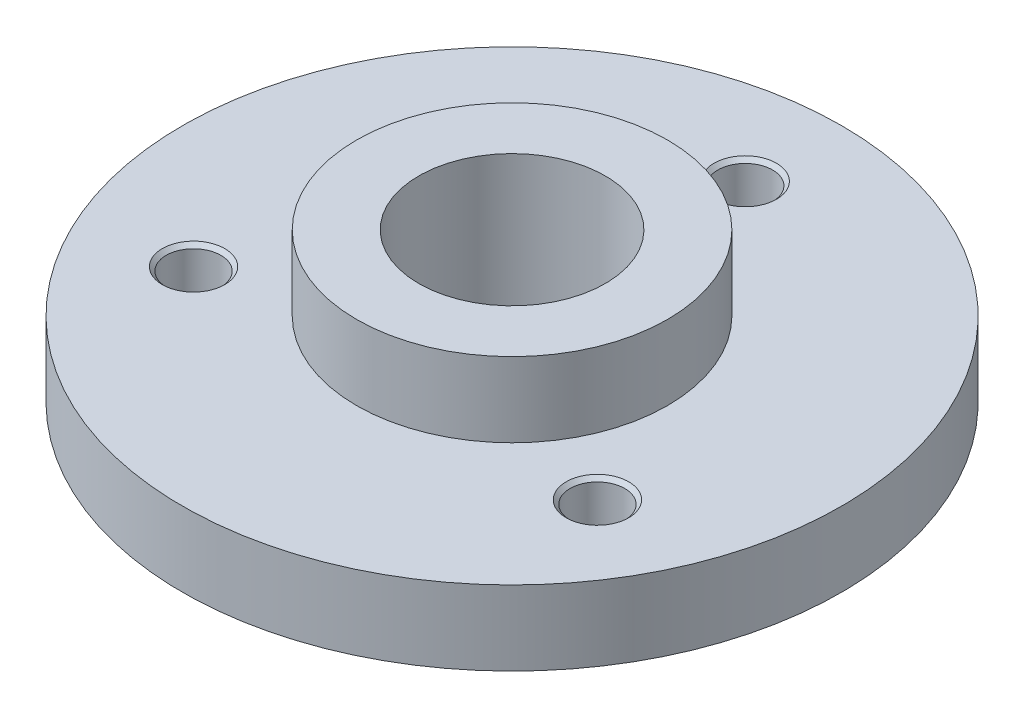
ISO-10303-21;
HEADER;
FILE_DESCRIPTION(('STEP AP214'),'2;1');
FILE_NAME('part.step','',(''),(''),'','','');
FILE_SCHEMA(('AUTOMOTIVE_DESIGN { 1 0 10303 214 1 1 1 1 }'));
ENDSEC;
DATA;
#1=APPLICATION_CONTEXT('core data for automotive mechanical design processes');
#2=APPLICATION_PROTOCOL_DEFINITION('international standard','automotive_design',2000,#1);
#3=PRODUCT_CONTEXT('',#1,'mechanical');
#4=PRODUCT('Part','Part','',(#3));
#5=PRODUCT_RELATED_PRODUCT_CATEGORY('part','',(#4));
#6=PRODUCT_DEFINITION_FORMATION('','',#4);
#7=PRODUCT_DEFINITION_CONTEXT('part definition',#1,'design');
#8=PRODUCT_DEFINITION('design','',#6,#7);
#9=PRODUCT_DEFINITION_SHAPE('','',#8);
#10=(LENGTH_UNIT() NAMED_UNIT(*) SI_UNIT(.MILLI.,.METRE.));
#11=(NAMED_UNIT(*) PLANE_ANGLE_UNIT() SI_UNIT($,.RADIAN.));
#12=(NAMED_UNIT(*) SI_UNIT($,.STERADIAN.) SOLID_ANGLE_UNIT());
#13=UNCERTAINTY_MEASURE_WITH_UNIT(LENGTH_MEASURE(1.E-05),#10,'distance_accuracy_value','');
#14=(GEOMETRIC_REPRESENTATION_CONTEXT(3) GLOBAL_UNCERTAINTY_ASSIGNED_CONTEXT((#13)) GLOBAL_UNIT_ASSIGNED_CONTEXT((#10,
#11,#12)) REPRESENTATION_CONTEXT('',''));
#15=CARTESIAN_POINT('',(0.,0.,0.));
#16=DIRECTION('',(0.,0.,1.));
#17=DIRECTION('',(1.,0.,0.));
#18=AXIS2_PLACEMENT_3D('',#15,#16,#17);
#19=CARTESIAN_POINT('',(0.,0.,-53.));
#20=DIRECTION('',(0.,-1.,0.));
#21=DIRECTION('',(0.,0.,-1.));
#22=AXIS2_PLACEMENT_3D('',#19,#20,#21);
#23=PLANE('',#22);
#24=CARTESIAN_POINT('',(-32.4759526419166,0.,18.7499999999997));
#25=DIRECTION('',(0.,1.,0.));
#26=DIRECTION('',(0.,0.,1.));
#27=AXIS2_PLACEMENT_3D('',#24,#25,#26);
#28=CIRCLE('',#27,4.4);
#29=CARTESIAN_POINT('',(-32.4759526419166,0.,23.1499999999997));
#30=VERTEX_POINT('',#29);
#31=EDGE_CURVE('E102',#30,#30,#28,.T.);
#32=ORIENTED_EDGE('',*,*,#31,.T.);
#33=EDGE_LOOP('',(#32));
#34=FACE_BOUND('',#33,.T.);
#35=CARTESIAN_POINT('',(32.4759526419164,0.,18.7500000000002));
#36=DIRECTION('',(0.,1.,0.));
#37=DIRECTION('',(0.,0.,1.));
#38=AXIS2_PLACEMENT_3D('',#35,#36,#37);
#39=CIRCLE('',#38,4.39999999999999);
#40=CARTESIAN_POINT('',(32.4759526419164,0.,23.1500000000001));
#41=VERTEX_POINT('',#40);
#42=EDGE_CURVE('E90',#41,#41,#39,.T.);
#43=ORIENTED_EDGE('',*,*,#42,.T.);
#44=EDGE_LOOP('',(#43));
#45=FACE_BOUND('',#44,.T.);
#46=CARTESIAN_POINT('',(0.,0.,-37.5));
#47=DIRECTION('',(0.,1.,0.));
#48=DIRECTION('',(0.,0.,1.));
#49=AXIS2_PLACEMENT_3D('',#46,#47,#48);
#50=CIRCLE('',#49,4.4);
#51=CARTESIAN_POINT('',(0.,0.,-33.1));
#52=VERTEX_POINT('',#51);
#53=EDGE_CURVE('E78',#52,#52,#50,.T.);
#54=ORIENTED_EDGE('',*,*,#53,.T.);
#55=EDGE_LOOP('',(#54));
#56=FACE_BOUND('',#55,.T.);
#57=CARTESIAN_POINT('',(0.,0.,0.));
#58=DIRECTION('',(0.,1.,0.));
#59=DIRECTION('',(0.,0.,1.));
#60=AXIS2_PLACEMENT_3D('',#57,#58,#59);
#61=CIRCLE('',#60,15.);
#62=CARTESIAN_POINT('',(0.,0.,15.));
#63=VERTEX_POINT('',#62);
#64=EDGE_CURVE('E70',#63,#63,#61,.T.);
#65=ORIENTED_EDGE('',*,*,#64,.T.);
#66=EDGE_LOOP('',(#65));
#67=FACE_BOUND('',#66,.T.);
#68=CARTESIAN_POINT('',(0.,0.,0.));
#69=DIRECTION('',(0.,-1.,0.));
#70=DIRECTION('',(0.,0.,-1.));
#71=AXIS2_PLACEMENT_3D('',#68,#69,#70);
#72=CIRCLE('',#71,53.);
#73=CARTESIAN_POINT('',(0.,0.,-53.));
#74=VERTEX_POINT('',#73);
#75=EDGE_CURVE('E64',#74,#74,#72,.T.);
#76=ORIENTED_EDGE('',*,*,#75,.T.);
#77=EDGE_LOOP('',(#76));
#78=FACE_BOUND('',#77,.T.);
#79=ADVANCED_FACE('F47',(#34,#45,#56,#67,#78),#23,.T.);
#80=CARTESIAN_POINT('',(0.,24.,0.));
#81=DIRECTION('',(0.,1.,0.));
#82=DIRECTION('',(0.,0.,1.));
#83=AXIS2_PLACEMENT_3D('',#80,#81,#82);
#84=PLANE('',#83);
#85=CARTESIAN_POINT('',(0.,24.,0.));
#86=DIRECTION('',(0.,1.,0.));
#87=DIRECTION('',(0.,0.,1.));
#88=AXIS2_PLACEMENT_3D('',#85,#86,#87);
#89=CIRCLE('',#88,15.);
#90=CARTESIAN_POINT('',(0.,24.,15.));
#91=VERTEX_POINT('',#90);
#92=EDGE_CURVE('E74',#91,#91,#89,.T.);
#93=ORIENTED_EDGE('',*,*,#92,.F.);
#94=EDGE_LOOP('',(#93));
#95=FACE_BOUND('',#94,.T.);
#96=CARTESIAN_POINT('',(0.,24.,0.));
#97=DIRECTION('',(0.,-1.,0.));
#98=DIRECTION('',(0.,0.,-1.));
#99=AXIS2_PLACEMENT_3D('',#96,#97,#98);
#100=CIRCLE('',#99,25.);
#101=CARTESIAN_POINT('',(0.,24.,-25.));
#102=VERTEX_POINT('',#101);
#103=EDGE_CURVE('E10',#102,#102,#100,.T.);
#104=ORIENTED_EDGE('',*,*,#103,.F.);
#105=EDGE_LOOP('',(#104));
#106=FACE_BOUND('',#105,.T.);
#107=ADVANCED_FACE('F136',(#95,#106),#84,.T.);
#108=CARTESIAN_POINT('',(0.,0.,0.));
#109=DIRECTION('',(0.,-1.,0.));
#110=DIRECTION('',(0.,0.,-1.));
#111=AXIS2_PLACEMENT_3D('',#108,#109,#110);
#112=CYLINDRICAL_SURFACE('',#111,25.);
#113=ORIENTED_EDGE('',*,*,#103,.T.);
#114=EDGE_LOOP('',(#113));
#115=FACE_BOUND('',#114,.T.);
#116=CARTESIAN_POINT('',(0.,12.,0.));
#117=DIRECTION('',(0.,-1.,0.));
#118=DIRECTION('',(0.,0.,-1.));
#119=AXIS2_PLACEMENT_3D('',#116,#117,#118);
#120=CIRCLE('',#119,25.);
#121=CARTESIAN_POINT('',(0.,12.,-25.));
#122=VERTEX_POINT('',#121);
#123=EDGE_CURVE('E54',#122,#122,#120,.T.);
#124=ORIENTED_EDGE('',*,*,#123,.F.);
#125=EDGE_LOOP('',(#124));
#126=FACE_BOUND('',#125,.T.);
#127=ADVANCED_FACE('F121',(#115,#126),#112,.T.);
#128=CARTESIAN_POINT('',(0.,12.,-25.));
#129=DIRECTION('',(0.,1.,0.));
#130=DIRECTION('',(0.,0.,1.));
#131=AXIS2_PLACEMENT_3D('',#128,#129,#130);
#132=PLANE('',#131);
#133=CARTESIAN_POINT('',(-32.4759526419166,12.,18.7499999999997));
#134=DIRECTION('',(0.,1.,0.));
#135=DIRECTION('',(0.,0.,1.));
#136=AXIS2_PLACEMENT_3D('',#133,#134,#135);
#137=CIRCLE('',#136,5.025);
#138=CARTESIAN_POINT('',(-32.4759526419166,12.,23.7749999999997));
#139=VERTEX_POINT('',#138);
#140=EDGE_CURVE('E110',#139,#139,#137,.T.);
#141=ORIENTED_EDGE('',*,*,#140,.F.);
#142=EDGE_LOOP('',(#141));
#143=FACE_BOUND('',#142,.T.);
#144=CARTESIAN_POINT('',(32.4759526419164,12.,18.7500000000002));
#145=DIRECTION('',(0.,1.,0.));
#146=DIRECTION('',(0.,0.,1.));
#147=AXIS2_PLACEMENT_3D('',#144,#145,#146);
#148=CIRCLE('',#147,5.025);
#149=CARTESIAN_POINT('',(32.4759526419164,12.,23.7750000000002));
#150=VERTEX_POINT('',#149);
#151=EDGE_CURVE('E98',#150,#150,#148,.T.);
#152=ORIENTED_EDGE('',*,*,#151,.F.);
#153=EDGE_LOOP('',(#152));
#154=FACE_BOUND('',#153,.T.);
#155=CARTESIAN_POINT('',(0.,12.,-37.5));
#156=DIRECTION('',(0.,1.,0.));
#157=DIRECTION('',(0.,0.,1.));
#158=AXIS2_PLACEMENT_3D('',#155,#156,#157);
#159=CIRCLE('',#158,5.025);
#160=CARTESIAN_POINT('',(0.,12.,-32.475));
#161=VERTEX_POINT('',#160);
#162=EDGE_CURVE('E86',#161,#161,#159,.T.);
#163=ORIENTED_EDGE('',*,*,#162,.F.);
#164=EDGE_LOOP('',(#163));
#165=FACE_BOUND('',#164,.T.);
#166=ORIENTED_EDGE('',*,*,#123,.T.);
#167=EDGE_LOOP('',(#166));
#168=FACE_BOUND('',#167,.T.);
#169=CARTESIAN_POINT('',(0.,12.,0.));
#170=DIRECTION('',(0.,-1.,0.));
#171=DIRECTION('',(0.,0.,-1.));
#172=AXIS2_PLACEMENT_3D('',#169,#170,#171);
#173=CIRCLE('',#172,53.);
#174=CARTESIAN_POINT('',(0.,12.,-53.));
#175=VERTEX_POINT('',#174);
#176=EDGE_CURVE('E59',#175,#175,#173,.T.);
#177=ORIENTED_EDGE('',*,*,#176,.F.);
#178=EDGE_LOOP('',(#177));
#179=FACE_BOUND('',#178,.T.);
#180=ADVANCED_FACE('F117',(#143,#154,#165,#168,#179),#132,.T.);
#181=CARTESIAN_POINT('',(0.,0.,0.));
#182=DIRECTION('',(0.,-1.,0.));
#183=DIRECTION('',(0.,0.,-1.));
#184=AXIS2_PLACEMENT_3D('',#181,#182,#183);
#185=CYLINDRICAL_SURFACE('',#184,53.);
#186=ORIENTED_EDGE('',*,*,#176,.T.);
#187=EDGE_LOOP('',(#186));
#188=FACE_BOUND('',#187,.T.);
#189=ORIENTED_EDGE('',*,*,#75,.F.);
#190=EDGE_LOOP('',(#189));
#191=FACE_BOUND('',#190,.T.);
#192=ADVANCED_FACE('F120',(#188,#191),#185,.T.);
#193=CARTESIAN_POINT('',(0.,24.,0.));
#194=DIRECTION('',(0.,1.,0.));
#195=DIRECTION('',(0.,0.,1.));
#196=AXIS2_PLACEMENT_3D('',#193,#194,#195);
#197=CYLINDRICAL_SURFACE('',#196,15.);
#198=ORIENTED_EDGE('',*,*,#64,.F.);
#199=EDGE_LOOP('',(#198));
#200=FACE_BOUND('',#199,.T.);
#201=ORIENTED_EDGE('',*,*,#92,.T.);
#202=EDGE_LOOP('',(#201));
#203=FACE_BOUND('',#202,.T.);
#204=ADVANCED_FACE('F131',(#200,#203),#197,.F.);
#205=CARTESIAN_POINT('',(0.,12.,-37.5));
#206=DIRECTION('',(0.,1.,0.));
#207=DIRECTION('',(0.,0.,1.));
#208=AXIS2_PLACEMENT_3D('',#205,#206,#207);
#209=CYLINDRICAL_SURFACE('',#208,4.4);
#210=ORIENTED_EDGE('',*,*,#53,.F.);
#211=EDGE_LOOP('',(#210));
#212=FACE_BOUND('',#211,.T.);
#213=CARTESIAN_POINT('',(0.,11.375,-37.5));
#214=DIRECTION('',(0.,1.,0.));
#215=DIRECTION('',(0.,0.,1.));
#216=AXIS2_PLACEMENT_3D('',#213,#214,#215);
#217=CIRCLE('',#216,4.4);
#218=CARTESIAN_POINT('',(0.,11.375,-33.1));
#219=VERTEX_POINT('',#218);
#220=EDGE_CURVE('E82',#219,#219,#217,.T.);
#221=ORIENTED_EDGE('',*,*,#220,.T.);
#222=EDGE_LOOP('',(#221));
#223=FACE_BOUND('',#222,.T.);
#224=ADVANCED_FACE('F153',(#212,#223),#209,.F.);
#225=CARTESIAN_POINT('',(0.,12.,-37.5));
#226=DIRECTION('',(0.,1.,0.));
#227=DIRECTION('',(0.,0.,1.));
#228=AXIS2_PLACEMENT_3D('',#225,#226,#227);
#229=CONICAL_SURFACE('',#228,5.025,0.785398163397447);
#230=ORIENTED_EDGE('',*,*,#220,.F.);
#231=EDGE_LOOP('',(#230));
#232=FACE_BOUND('',#231,.T.);
#233=ORIENTED_EDGE('',*,*,#162,.T.);
#234=EDGE_LOOP('',(#233));
#235=FACE_BOUND('',#234,.T.);
#236=ADVANCED_FACE('F161',(#232,#235),#229,.F.);
#237=CARTESIAN_POINT('',(32.4759526419164,12.,18.7500000000002));
#238=DIRECTION('',(0.,1.,0.));
#239=DIRECTION('',(0.,0.,1.));
#240=AXIS2_PLACEMENT_3D('',#237,#238,#239);
#241=CYLINDRICAL_SURFACE('',#240,4.4);
#242=ORIENTED_EDGE('',*,*,#42,.F.);
#243=EDGE_LOOP('',(#242));
#244=FACE_BOUND('',#243,.T.);
#245=CARTESIAN_POINT('',(32.4759526419164,11.375,18.7500000000002));
#246=DIRECTION('',(0.,1.,0.));
#247=DIRECTION('',(0.,0.,1.));
#248=AXIS2_PLACEMENT_3D('',#245,#246,#247);
#249=CIRCLE('',#248,4.4);
#250=CARTESIAN_POINT('',(32.4759526419164,11.375,23.1500000000002));
#251=VERTEX_POINT('',#250);
#252=EDGE_CURVE('E94',#251,#251,#249,.T.);
#253=ORIENTED_EDGE('',*,*,#252,.T.);
#254=EDGE_LOOP('',(#253));
#255=FACE_BOUND('',#254,.T.);
#256=ADVANCED_FACE('F209',(#244,#255),#241,.F.);
#257=CARTESIAN_POINT('',(32.4759526419164,12.,18.7500000000002));
#258=DIRECTION('',(0.,1.,0.));
#259=DIRECTION('',(0.,0.,1.));
#260=AXIS2_PLACEMENT_3D('',#257,#258,#259);
#261=CONICAL_SURFACE('',#260,5.025,0.785398163397444);
#262=ORIENTED_EDGE('',*,*,#252,.F.);
#263=EDGE_LOOP('',(#262));
#264=FACE_BOUND('',#263,.T.);
#265=ORIENTED_EDGE('',*,*,#151,.T.);
#266=EDGE_LOOP('',(#265));
#267=FACE_BOUND('',#266,.T.);
#268=ADVANCED_FACE('F217',(#264,#267),#261,.F.);
#269=CARTESIAN_POINT('',(-32.4759526419166,12.,18.7499999999997));
#270=DIRECTION('',(0.,1.,0.));
#271=DIRECTION('',(0.,0.,1.));
#272=AXIS2_PLACEMENT_3D('',#269,#270,#271);
#273=CYLINDRICAL_SURFACE('',#272,4.4);
#274=ORIENTED_EDGE('',*,*,#31,.F.);
#275=EDGE_LOOP('',(#274));
#276=FACE_BOUND('',#275,.T.);
#277=CARTESIAN_POINT('',(-32.4759526419166,11.375,18.7499999999997));
#278=DIRECTION('',(0.,1.,0.));
#279=DIRECTION('',(0.,0.,1.));
#280=AXIS2_PLACEMENT_3D('',#277,#278,#279);
#281=CIRCLE('',#280,4.4);
#282=CARTESIAN_POINT('',(-32.4759526419166,11.375,23.1499999999997));
#283=VERTEX_POINT('',#282);
#284=EDGE_CURVE('E106',#283,#283,#281,.T.);
#285=ORIENTED_EDGE('',*,*,#284,.T.);
#286=EDGE_LOOP('',(#285));
#287=FACE_BOUND('',#286,.T.);
#288=ADVANCED_FACE('F227',(#276,#287),#273,.F.);
#289=CARTESIAN_POINT('',(-32.4759526419166,12.,18.7499999999997));
#290=DIRECTION('',(0.,1.,0.));
#291=DIRECTION('',(0.,0.,1.));
#292=AXIS2_PLACEMENT_3D('',#289,#290,#291);
#293=CONICAL_SURFACE('',#292,5.025,0.785398163397447);
#294=ORIENTED_EDGE('',*,*,#284,.F.);
#295=EDGE_LOOP('',(#294));
#296=FACE_BOUND('',#295,.T.);
#297=ORIENTED_EDGE('',*,*,#140,.T.);
#298=EDGE_LOOP('',(#297));
#299=FACE_BOUND('',#298,.T.);
#300=ADVANCED_FACE('F115',(#296,#299),#293,.F.);
#301=CLOSED_SHELL('',(#79,#107,#127,#180,#192,#204,#224,#236,#256,#268,#288,#300));
#302=MANIFOLD_SOLID_BREP('B2',#301);
#303=ADVANCED_BREP_SHAPE_REPRESENTATION('',(#18,#302),#14);
#304=SHAPE_DEFINITION_REPRESENTATION(#9,#303);
ENDSEC;
END-ISO-10303-21;
